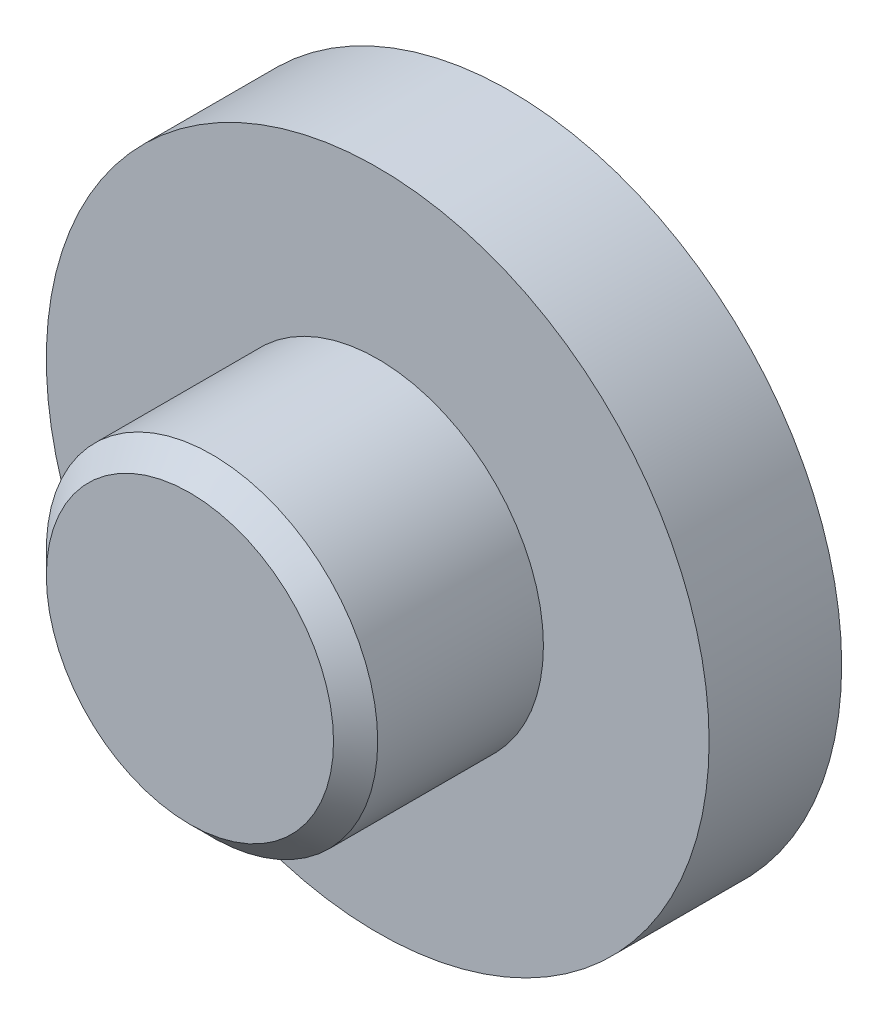
ISO-10303-21;
HEADER;
FILE_DESCRIPTION(('STEP AP214'),'2;1');
FILE_NAME('part.step','',(''),(''),'','','');
FILE_SCHEMA(('AUTOMOTIVE_DESIGN { 1 0 10303 214 1 1 1 1 }'));
ENDSEC;
DATA;
#1=APPLICATION_CONTEXT('core data for automotive mechanical design processes');
#2=APPLICATION_PROTOCOL_DEFINITION('international standard','automotive_design',2000,#1);
#3=PRODUCT_CONTEXT('',#1,'mechanical');
#4=PRODUCT('Part','Part','',(#3));
#5=PRODUCT_RELATED_PRODUCT_CATEGORY('part','',(#4));
#6=PRODUCT_DEFINITION_FORMATION('','',#4);
#7=PRODUCT_DEFINITION_CONTEXT('part definition',#1,'design');
#8=PRODUCT_DEFINITION('design','',#6,#7);
#9=PRODUCT_DEFINITION_SHAPE('','',#8);
#10=(LENGTH_UNIT() NAMED_UNIT(*) SI_UNIT(.MILLI.,.METRE.));
#11=(NAMED_UNIT(*) PLANE_ANGLE_UNIT() SI_UNIT($,.RADIAN.));
#12=(NAMED_UNIT(*) SI_UNIT($,.STERADIAN.) SOLID_ANGLE_UNIT());
#13=UNCERTAINTY_MEASURE_WITH_UNIT(LENGTH_MEASURE(1.E-05),#10,'distance_accuracy_value','');
#14=(GEOMETRIC_REPRESENTATION_CONTEXT(3) GLOBAL_UNCERTAINTY_ASSIGNED_CONTEXT((#13)) GLOBAL_UNIT_ASSIGNED_CONTEXT((#10,
#11,#12)) REPRESENTATION_CONTEXT('',''));
#15=CARTESIAN_POINT('',(0.,0.,0.));
#16=DIRECTION('',(0.,0.,1.));
#17=DIRECTION('',(1.,0.,0.));
#18=AXIS2_PLACEMENT_3D('',#15,#16,#17);
#19=CARTESIAN_POINT('',(0.,0.,12.));
#20=DIRECTION('',(0.,0.,-1.));
#21=DIRECTION('',(-1.,0.,0.));
#22=AXIS2_PLACEMENT_3D('',#19,#20,#21);
#23=CYLINDRICAL_SURFACE('',#22,30.);
#24=CARTESIAN_POINT('',(0.,0.,12.));
#25=DIRECTION('',(0.,0.,1.));
#26=DIRECTION('',(1.,0.,0.));
#27=AXIS2_PLACEMENT_3D('',#24,#25,#26);
#28=CIRCLE('',#27,30.);
#29=CARTESIAN_POINT('',(30.,0.,12.));
#30=VERTEX_POINT('',#29);
#31=EDGE_CURVE('E58',#30,#30,#28,.T.);
#32=ORIENTED_EDGE('',*,*,#31,.F.);
#33=EDGE_LOOP('',(#32));
#34=FACE_BOUND('',#33,.T.);
#35=CARTESIAN_POINT('',(0.,0.,0.));
#36=DIRECTION('',(0.,0.,1.));
#37=DIRECTION('',(1.,0.,0.));
#38=AXIS2_PLACEMENT_3D('',#35,#36,#37);
#39=CIRCLE('',#38,30.);
#40=CARTESIAN_POINT('',(30.,0.,0.));
#41=VERTEX_POINT('',#40);
#42=EDGE_CURVE('E61',#41,#41,#39,.T.);
#43=ORIENTED_EDGE('',*,*,#42,.T.);
#44=EDGE_LOOP('',(#43));
#45=FACE_BOUND('',#44,.T.);
#46=ADVANCED_FACE('F39',(#34,#45),#23,.T.);
#47=CARTESIAN_POINT('',(0.,0.,12.));
#48=DIRECTION('',(0.,0.,1.));
#49=DIRECTION('',(1.,0.,0.));
#50=AXIS2_PLACEMENT_3D('',#47,#48,#49);
#51=PLANE('',#50);
#52=CARTESIAN_POINT('',(0.,0.,12.));
#53=DIRECTION('',(0.,0.,1.));
#54=DIRECTION('',(1.,0.,0.));
#55=AXIS2_PLACEMENT_3D('',#52,#53,#54);
#56=CIRCLE('',#55,15.);
#57=CARTESIAN_POINT('',(15.,0.,12.));
#58=VERTEX_POINT('',#57);
#59=EDGE_CURVE('E53',#58,#58,#56,.T.);
#60=ORIENTED_EDGE('',*,*,#59,.F.);
#61=EDGE_LOOP('',(#60));
#62=FACE_BOUND('',#61,.T.);
#63=ORIENTED_EDGE('',*,*,#31,.T.);
#64=EDGE_LOOP('',(#63));
#65=FACE_BOUND('',#64,.T.);
#66=ADVANCED_FACE('F69',(#62,#65),#51,.T.);
#67=CARTESIAN_POINT('',(0.,0.,0.));
#68=DIRECTION('',(0.,0.,1.));
#69=DIRECTION('',(1.,0.,0.));
#70=AXIS2_PLACEMENT_3D('',#67,#68,#69);
#71=PLANE('',#70);
#72=ORIENTED_EDGE('',*,*,#42,.F.);
#73=EDGE_LOOP('',(#72));
#74=FACE_BOUND('',#73,.T.);
#75=ADVANCED_FACE('F75',(#74),#71,.F.);
#76=CARTESIAN_POINT('',(0.,0.,29.));
#77=DIRECTION('',(0.,0.,-1.));
#78=DIRECTION('',(-1.,0.,0.));
#79=AXIS2_PLACEMENT_3D('',#76,#77,#78);
#80=CYLINDRICAL_SURFACE('',#79,15.);
#81=CARTESIAN_POINT('',(0.,0.,27.));
#82=DIRECTION('',(0.,0.,1.));
#83=DIRECTION('',(1.,0.,0.));
#84=AXIS2_PLACEMENT_3D('',#81,#82,#83);
#85=CIRCLE('',#84,15.);
#86=CARTESIAN_POINT('',(15.,0.,27.));
#87=VERTEX_POINT('',#86);
#88=EDGE_CURVE('E10',#87,#87,#85,.F.);
#89=ORIENTED_EDGE('',*,*,#88,.T.);
#90=EDGE_LOOP('',(#89));
#91=FACE_BOUND('',#90,.T.);
#92=ORIENTED_EDGE('',*,*,#59,.T.);
#93=EDGE_LOOP('',(#92));
#94=FACE_BOUND('',#93,.T.);
#95=ADVANCED_FACE('F77',(#91,#94),#80,.T.);
#96=CARTESIAN_POINT('',(0.,0.,29.));
#97=DIRECTION('',(0.,0.,1.));
#98=DIRECTION('',(1.,0.,0.));
#99=AXIS2_PLACEMENT_3D('',#96,#97,#98);
#100=PLANE('',#99);
#101=CARTESIAN_POINT('',(0.,0.,29.));
#102=DIRECTION('',(0.,0.,1.));
#103=DIRECTION('',(1.,0.,0.));
#104=AXIS2_PLACEMENT_3D('',#101,#102,#103);
#105=CIRCLE('',#104,13.);
#106=CARTESIAN_POINT('',(13.,0.,29.));
#107=VERTEX_POINT('',#106);
#108=EDGE_CURVE('E48',#107,#107,#105,.T.);
#109=ORIENTED_EDGE('',*,*,#108,.T.);
#110=EDGE_LOOP('',(#109));
#111=FACE_BOUND('',#110,.T.);
#112=ADVANCED_FACE('F83',(#111),#100,.T.);
#113=CARTESIAN_POINT('',(0.,0.,29.));
#114=DIRECTION('',(0.,0.,-1.));
#115=DIRECTION('',(-1.,0.,0.));
#116=AXIS2_PLACEMENT_3D('',#113,#114,#115);
#117=CONICAL_SURFACE('',#116,13.,0.785398163397446);
#118=ORIENTED_EDGE('',*,*,#88,.F.);
#119=EDGE_LOOP('',(#118));
#120=FACE_BOUND('',#119,.T.);
#121=ORIENTED_EDGE('',*,*,#108,.F.);
#122=EDGE_LOOP('',(#121));
#123=FACE_BOUND('',#122,.T.);
#124=ADVANCED_FACE('F42',(#120,#123),#117,.T.);
#125=CLOSED_SHELL('',(#46,#66,#75,#95,#112,#124));
#126=MANIFOLD_SOLID_BREP('B2',#125);
#127=ADVANCED_BREP_SHAPE_REPRESENTATION('',(#18,#126),#14);
#128=SHAPE_DEFINITION_REPRESENTATION(#9,#127);
ENDSEC;
END-ISO-10303-21;
